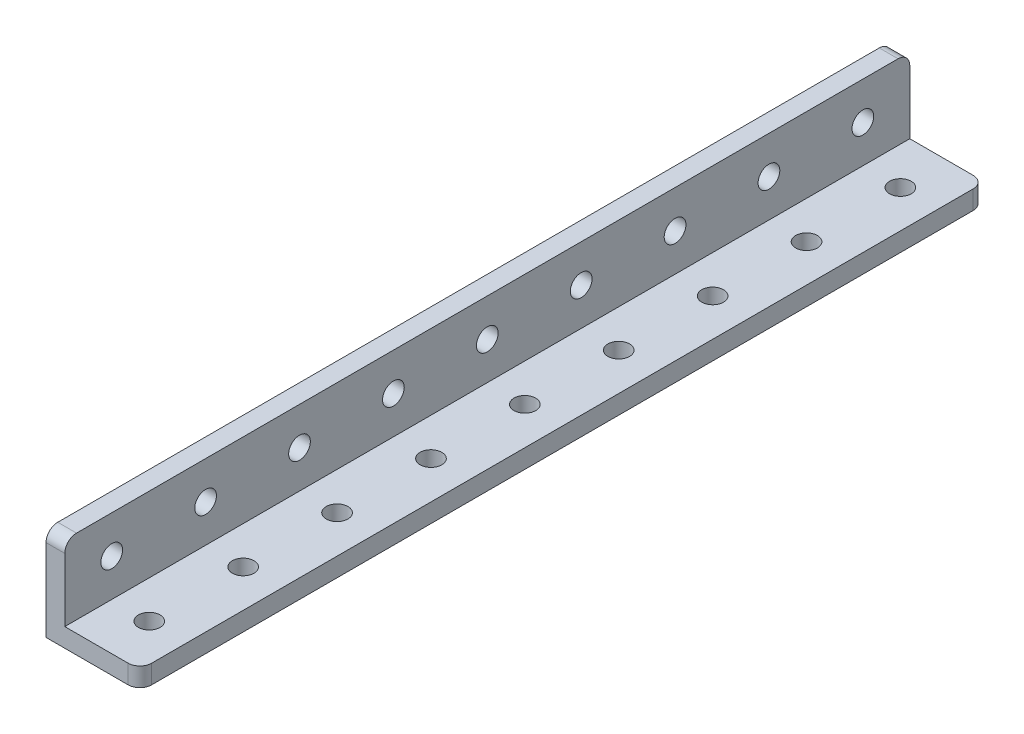
ISO-10303-21;
HEADER;
FILE_DESCRIPTION(('STEP AP214'),'2;1');
FILE_NAME('part.step','',(''),(''),'','','');
FILE_SCHEMA(('AUTOMOTIVE_DESIGN { 1 0 10303 214 1 1 1 1 }'));
ENDSEC;
DATA;
#1=APPLICATION_CONTEXT('core data for automotive mechanical design processes');
#2=APPLICATION_PROTOCOL_DEFINITION('international standard','automotive_design',2000,#1);
#3=PRODUCT_CONTEXT('',#1,'mechanical');
#4=PRODUCT('Part','Part','',(#3));
#5=PRODUCT_RELATED_PRODUCT_CATEGORY('part','',(#4));
#6=PRODUCT_DEFINITION_FORMATION('','',#4);
#7=PRODUCT_DEFINITION_CONTEXT('part definition',#1,'design');
#8=PRODUCT_DEFINITION('design','',#6,#7);
#9=PRODUCT_DEFINITION_SHAPE('','',#8);
#10=(LENGTH_UNIT() NAMED_UNIT(*) SI_UNIT(.MILLI.,.METRE.));
#11=(NAMED_UNIT(*) PLANE_ANGLE_UNIT() SI_UNIT($,.RADIAN.));
#12=(NAMED_UNIT(*) SI_UNIT($,.STERADIAN.) SOLID_ANGLE_UNIT());
#13=UNCERTAINTY_MEASURE_WITH_UNIT(LENGTH_MEASURE(1.E-05),#10,'distance_accuracy_value','');
#14=(GEOMETRIC_REPRESENTATION_CONTEXT(3) GLOBAL_UNCERTAINTY_ASSIGNED_CONTEXT((#13)) GLOBAL_UNIT_ASSIGNED_CONTEXT((#10,
#11,#12)) REPRESENTATION_CONTEXT('',''));
#15=CARTESIAN_POINT('',(0.,0.,0.));
#16=DIRECTION('',(0.,0.,1.));
#17=DIRECTION('',(1.,0.,0.));
#18=AXIS2_PLACEMENT_3D('',#15,#16,#17);
#19=CARTESIAN_POINT('',(3.2,16.,-144.));
#20=DIRECTION('',(0.,1.,0.));
#21=DIRECTION('',(0.,0.,1.));
#22=AXIS2_PLACEMENT_3D('',#19,#20,#21);
#23=PLANE('',#22);
#24=DIRECTION('',(0.,0.,1.));
#25=VECTOR('',#24,1.);
#26=CARTESIAN_POINT('',(3.2,16.,-144.));
#27=LINE('',#26,#25);
#28=CARTESIAN_POINT('',(3.2,16.,-142.));
#29=VERTEX_POINT('',#28);
#30=CARTESIAN_POINT('',(3.2,16.,-2.));
#31=VERTEX_POINT('',#30);
#32=EDGE_CURVE('E151',#29,#31,#27,.T.);
#33=ORIENTED_EDGE('',*,*,#32,.F.);
#34=DIRECTION('',(-1.,0.,0.));
#35=VECTOR('',#34,1.);
#36=CARTESIAN_POINT('',(0.,16.,-142.));
#37=LINE('',#36,#35);
#38=CARTESIAN_POINT('',(0.,16.,-142.));
#39=VERTEX_POINT('',#38);
#40=EDGE_CURVE('E165',#29,#39,#37,.T.);
#41=ORIENTED_EDGE('',*,*,#40,.T.);
#42=DIRECTION('',(0.,0.,1.));
#43=VECTOR('',#42,1.);
#44=CARTESIAN_POINT('',(0.,16.,-144.));
#45=LINE('',#44,#43);
#46=CARTESIAN_POINT('',(0.,16.,-2.));
#47=VERTEX_POINT('',#46);
#48=EDGE_CURVE('E129',#39,#47,#45,.T.);
#49=ORIENTED_EDGE('',*,*,#48,.T.);
#50=DIRECTION('',(-1.,0.,0.));
#51=VECTOR('',#50,1.);
#52=CARTESIAN_POINT('',(3.2,16.,-2.));
#53=LINE('',#52,#51);
#54=EDGE_CURVE('E154',#47,#31,#53,.F.);
#55=ORIENTED_EDGE('',*,*,#54,.T.);
#56=EDGE_LOOP('',(#33,#41,#49,#55));
#57=FACE_BOUND('',#56,.T.);
#58=ADVANCED_FACE('F32',(#57),#23,.T.);
#59=CARTESIAN_POINT('',(3.2,3.2,-144.));
#60=DIRECTION('',(1.,0.,0.));
#61=DIRECTION('',(0.,0.,-1.));
#62=AXIS2_PLACEMENT_3D('',#59,#60,#61);
#63=PLANE('',#62);
#64=CARTESIAN_POINT('',(3.2,9.6,-72.));
#65=DIRECTION('',(1.,0.,0.));
#66=DIRECTION('',(0.,0.,-1.));
#67=AXIS2_PLACEMENT_3D('',#64,#65,#66);
#68=CIRCLE('',#67,1.85);
#69=CARTESIAN_POINT('',(3.2,9.6,-73.85));
#70=VERTEX_POINT('',#69);
#71=EDGE_CURVE('E375',#70,#70,#68,.T.);
#72=ORIENTED_EDGE('',*,*,#71,.F.);
#73=EDGE_LOOP('',(#72));
#74=FACE_BOUND('',#73,.T.);
#75=CARTESIAN_POINT('',(3.2,9.6,-56.));
#76=DIRECTION('',(1.,0.,0.));
#77=DIRECTION('',(0.,0.,-1.));
#78=AXIS2_PLACEMENT_3D('',#75,#76,#77);
#79=CIRCLE('',#78,1.85);
#80=CARTESIAN_POINT('',(3.2,9.6,-57.85));
#81=VERTEX_POINT('',#80);
#82=EDGE_CURVE('E381',#81,#81,#79,.T.);
#83=ORIENTED_EDGE('',*,*,#82,.F.);
#84=EDGE_LOOP('',(#83));
#85=FACE_BOUND('',#84,.T.);
#86=CARTESIAN_POINT('',(3.2,9.6,-40.));
#87=DIRECTION('',(1.,0.,0.));
#88=DIRECTION('',(0.,0.,-1.));
#89=AXIS2_PLACEMENT_3D('',#86,#87,#88);
#90=CIRCLE('',#89,1.85);
#91=CARTESIAN_POINT('',(3.2,9.6,-41.85));
#92=VERTEX_POINT('',#91);
#93=EDGE_CURVE('E387',#92,#92,#90,.T.);
#94=ORIENTED_EDGE('',*,*,#93,.F.);
#95=EDGE_LOOP('',(#94));
#96=FACE_BOUND('',#95,.T.);
#97=CARTESIAN_POINT('',(3.2,9.6,-24.));
#98=DIRECTION('',(1.,0.,0.));
#99=DIRECTION('',(0.,0.,-1.));
#100=AXIS2_PLACEMENT_3D('',#97,#98,#99);
#101=CIRCLE('',#100,1.85);
#102=CARTESIAN_POINT('',(3.2,9.6,-25.85));
#103=VERTEX_POINT('',#102);
#104=EDGE_CURVE('E393',#103,#103,#101,.T.);
#105=ORIENTED_EDGE('',*,*,#104,.F.);
#106=EDGE_LOOP('',(#105));
#107=FACE_BOUND('',#106,.T.);
#108=CARTESIAN_POINT('',(3.2,9.6,-8.00000000000001));
#109=DIRECTION('',(1.,0.,0.));
#110=DIRECTION('',(0.,0.,-1.));
#111=AXIS2_PLACEMENT_3D('',#108,#109,#110);
#112=CIRCLE('',#111,1.85);
#113=CARTESIAN_POINT('',(3.2,9.6,-9.85000000000001));
#114=VERTEX_POINT('',#113);
#115=EDGE_CURVE('E399',#114,#114,#112,.T.);
#116=ORIENTED_EDGE('',*,*,#115,.F.);
#117=EDGE_LOOP('',(#116));
#118=FACE_BOUND('',#117,.T.);
#119=CARTESIAN_POINT('',(3.2,9.59999999999956,-136.));
#120=DIRECTION('',(1.,0.,0.));
#121=DIRECTION('',(0.,0.,-1.));
#122=AXIS2_PLACEMENT_3D('',#119,#120,#121);
#123=CIRCLE('',#122,1.85);
#124=CARTESIAN_POINT('',(3.2,9.59999999999956,-137.85));
#125=VERTEX_POINT('',#124);
#126=EDGE_CURVE('E405',#125,#125,#123,.T.);
#127=ORIENTED_EDGE('',*,*,#126,.F.);
#128=EDGE_LOOP('',(#127));
#129=FACE_BOUND('',#128,.T.);
#130=CARTESIAN_POINT('',(3.2,9.59999999999967,-120.));
#131=DIRECTION('',(1.,0.,0.));
#132=DIRECTION('',(0.,0.,-1.));
#133=AXIS2_PLACEMENT_3D('',#130,#131,#132);
#134=CIRCLE('',#133,1.85);
#135=CARTESIAN_POINT('',(3.2,9.59999999999967,-121.85));
#136=VERTEX_POINT('',#135);
#137=EDGE_CURVE('E411',#136,#136,#134,.T.);
#138=ORIENTED_EDGE('',*,*,#137,.F.);
#139=EDGE_LOOP('',(#138));
#140=FACE_BOUND('',#139,.T.);
#141=CARTESIAN_POINT('',(3.2,9.59999999999978,-104.));
#142=DIRECTION('',(1.,0.,0.));
#143=DIRECTION('',(0.,0.,-1.));
#144=AXIS2_PLACEMENT_3D('',#141,#142,#143);
#145=CIRCLE('',#144,1.84999999999999);
#146=CARTESIAN_POINT('',(3.2,9.59999999999978,-105.85));
#147=VERTEX_POINT('',#146);
#148=EDGE_CURVE('E417',#147,#147,#145,.T.);
#149=ORIENTED_EDGE('',*,*,#148,.F.);
#150=EDGE_LOOP('',(#149));
#151=FACE_BOUND('',#150,.T.);
#152=CARTESIAN_POINT('',(3.2,9.59999999999989,-87.9999999999999));
#153=DIRECTION('',(1.,0.,0.));
#154=DIRECTION('',(0.,0.,-1.));
#155=AXIS2_PLACEMENT_3D('',#152,#153,#154);
#156=CIRCLE('',#155,1.85);
#157=CARTESIAN_POINT('',(3.2,9.59999999999989,-89.8499999999999));
#158=VERTEX_POINT('',#157);
#159=EDGE_CURVE('E145',#158,#158,#156,.T.);
#160=ORIENTED_EDGE('',*,*,#159,.F.);
#161=EDGE_LOOP('',(#160));
#162=FACE_BOUND('',#161,.T.);
#163=DIRECTION('',(0.,1.,0.));
#164=VECTOR('',#163,1.);
#165=CARTESIAN_POINT('',(3.2,3.2,-144.));
#166=LINE('',#165,#164);
#167=CARTESIAN_POINT('',(3.2,3.2,-144.));
#168=VERTEX_POINT('',#167);
#169=CARTESIAN_POINT('',(3.2,14.,-144.));
#170=VERTEX_POINT('',#169);
#171=EDGE_CURVE('E137',#168,#170,#166,.T.);
#172=ORIENTED_EDGE('',*,*,#171,.T.);
#173=CARTESIAN_POINT('',(3.2,14.,-142.));
#174=DIRECTION('',(1.,0.,0.));
#175=DIRECTION('',(0.,0.,-1.));
#176=AXIS2_PLACEMENT_3D('',#173,#174,#175);
#177=CIRCLE('',#176,2.);
#178=EDGE_CURVE('E176',#170,#29,#177,.T.);
#179=ORIENTED_EDGE('',*,*,#178,.T.);
#180=ORIENTED_EDGE('',*,*,#32,.T.);
#181=CARTESIAN_POINT('',(3.2,14.,-2.));
#182=DIRECTION('',(1.,0.,0.));
#183=DIRECTION('',(0.,0.,-1.));
#184=AXIS2_PLACEMENT_3D('',#181,#182,#183);
#185=CIRCLE('',#184,2.);
#186=CARTESIAN_POINT('',(3.2,14.,0.));
#187=VERTEX_POINT('',#186);
#188=EDGE_CURVE('E174',#31,#187,#185,.T.);
#189=ORIENTED_EDGE('',*,*,#188,.T.);
#190=DIRECTION('',(0.,1.,0.));
#191=VECTOR('',#190,1.);
#192=CARTESIAN_POINT('',(3.2,3.2,0.));
#193=LINE('',#192,#191);
#194=CARTESIAN_POINT('',(3.2,3.2,0.));
#195=VERTEX_POINT('',#194);
#196=EDGE_CURVE('E122',#195,#187,#193,.T.);
#197=ORIENTED_EDGE('',*,*,#196,.F.);
#198=DIRECTION('',(0.,0.,1.));
#199=VECTOR('',#198,1.);
#200=CARTESIAN_POINT('',(3.2,3.2,-144.));
#201=LINE('',#200,#199);
#202=EDGE_CURVE('E155',#168,#195,#201,.T.);
#203=ORIENTED_EDGE('',*,*,#202,.F.);
#204=EDGE_LOOP('',(#172,#179,#180,#189,#197,#203));
#205=FACE_BOUND('',#204,.T.);
#206=ADVANCED_FACE('F200',(#74,#85,#96,#107,#118,#129,#140,#151,#162,#205),#63,.T.);
#207=CARTESIAN_POINT('',(16.,3.2,-144.));
#208=DIRECTION('',(0.,1.,0.));
#209=DIRECTION('',(-1.,0.,0.));
#210=AXIS2_PLACEMENT_3D('',#207,#208,#209);
#211=PLANE('',#210);
#212=CARTESIAN_POINT('',(9.60000000000001,3.2,-72.));
#213=DIRECTION('',(0.,1.,0.));
#214=DIRECTION('',(-1.,0.,0.));
#215=AXIS2_PLACEMENT_3D('',#212,#213,#214);
#216=CIRCLE('',#215,1.85000000000001);
#217=CARTESIAN_POINT('',(7.75,3.2,-72.));
#218=VERTEX_POINT('',#217);
#219=EDGE_CURVE('E491',#218,#218,#216,.T.);
#220=ORIENTED_EDGE('',*,*,#219,.F.);
#221=EDGE_LOOP('',(#220));
#222=FACE_BOUND('',#221,.T.);
#223=CARTESIAN_POINT('',(9.59999999999996,3.2,-56.));
#224=DIRECTION('',(0.,1.,0.));
#225=DIRECTION('',(-1.,0.,0.));
#226=AXIS2_PLACEMENT_3D('',#223,#224,#225);
#227=CIRCLE('',#226,1.84999999999999);
#228=CARTESIAN_POINT('',(7.74999999999996,3.2,-56.));
#229=VERTEX_POINT('',#228);
#230=EDGE_CURVE('E487',#229,#229,#227,.T.);
#231=ORIENTED_EDGE('',*,*,#230,.F.);
#232=EDGE_LOOP('',(#231));
#233=FACE_BOUND('',#232,.T.);
#234=CARTESIAN_POINT('',(9.5999999999999,3.2,-40.));
#235=DIRECTION('',(0.,1.,0.));
#236=DIRECTION('',(-1.,0.,0.));
#237=AXIS2_PLACEMENT_3D('',#234,#235,#236);
#238=CIRCLE('',#237,1.85);
#239=CARTESIAN_POINT('',(7.7499999999999,3.2,-40.));
#240=VERTEX_POINT('',#239);
#241=EDGE_CURVE('E483',#240,#240,#238,.T.);
#242=ORIENTED_EDGE('',*,*,#241,.F.);
#243=EDGE_LOOP('',(#242));
#244=FACE_BOUND('',#243,.T.);
#245=CARTESIAN_POINT('',(9.59999999999984,3.2,-24.));
#246=DIRECTION('',(0.,1.,0.));
#247=DIRECTION('',(-1.,0.,0.));
#248=AXIS2_PLACEMENT_3D('',#245,#246,#247);
#249=CIRCLE('',#248,1.85000000000001);
#250=CARTESIAN_POINT('',(7.74999999999984,3.2,-24.));
#251=VERTEX_POINT('',#250);
#252=EDGE_CURVE('E479',#251,#251,#249,.T.);
#253=ORIENTED_EDGE('',*,*,#252,.F.);
#254=EDGE_LOOP('',(#253));
#255=FACE_BOUND('',#254,.T.);
#256=CARTESIAN_POINT('',(9.59999999999979,3.2,-8.00000000000005));
#257=DIRECTION('',(0.,1.,0.));
#258=DIRECTION('',(-1.,0.,0.));
#259=AXIS2_PLACEMENT_3D('',#256,#257,#258);
#260=CIRCLE('',#259,1.85000000000001);
#261=CARTESIAN_POINT('',(7.74999999999978,3.2,-8.00000000000005));
#262=VERTEX_POINT('',#261);
#263=EDGE_CURVE('E475',#262,#262,#260,.T.);
#264=ORIENTED_EDGE('',*,*,#263,.F.);
#265=EDGE_LOOP('',(#264));
#266=FACE_BOUND('',#265,.T.);
#267=CARTESIAN_POINT('',(9.60000000000067,3.2,-136.));
#268=DIRECTION('',(0.,1.,0.));
#269=DIRECTION('',(-1.,0.,0.));
#270=AXIS2_PLACEMENT_3D('',#267,#268,#269);
#271=CIRCLE('',#270,1.84999999999997);
#272=CARTESIAN_POINT('',(7.7500000000007,3.2,-136.));
#273=VERTEX_POINT('',#272);
#274=EDGE_CURVE('E471',#273,#273,#271,.T.);
#275=ORIENTED_EDGE('',*,*,#274,.F.);
#276=EDGE_LOOP('',(#275));
#277=FACE_BOUND('',#276,.T.);
#278=CARTESIAN_POINT('',(9.60000000000051,3.2,-120.));
#279=DIRECTION('',(0.,1.,0.));
#280=DIRECTION('',(-1.,0.,0.));
#281=AXIS2_PLACEMENT_3D('',#278,#279,#280);
#282=CIRCLE('',#281,1.85);
#283=CARTESIAN_POINT('',(7.75000000000051,3.2,-120.));
#284=VERTEX_POINT('',#283);
#285=EDGE_CURVE('E467',#284,#284,#282,.T.);
#286=ORIENTED_EDGE('',*,*,#285,.F.);
#287=EDGE_LOOP('',(#286));
#288=FACE_BOUND('',#287,.T.);
#289=CARTESIAN_POINT('',(9.60000000000034,3.2,-104.));
#290=DIRECTION('',(0.,1.,0.));
#291=DIRECTION('',(-1.,0.,0.));
#292=AXIS2_PLACEMENT_3D('',#289,#290,#291);
#293=CIRCLE('',#292,1.84999999999998);
#294=CARTESIAN_POINT('',(7.75000000000036,3.2,-104.));
#295=VERTEX_POINT('',#294);
#296=EDGE_CURVE('E364',#295,#295,#293,.T.);
#297=ORIENTED_EDGE('',*,*,#296,.F.);
#298=EDGE_LOOP('',(#297));
#299=FACE_BOUND('',#298,.T.);
#300=CARTESIAN_POINT('',(9.60000000000018,3.2,-88.));
#301=DIRECTION('',(0.,1.,0.));
#302=DIRECTION('',(-1.,0.,0.));
#303=AXIS2_PLACEMENT_3D('',#300,#301,#302);
#304=CIRCLE('',#303,1.85);
#305=CARTESIAN_POINT('',(7.75000000000018,3.2,-88.));
#306=VERTEX_POINT('',#305);
#307=EDGE_CURVE('E363',#306,#306,#304,.T.);
#308=ORIENTED_EDGE('',*,*,#307,.F.);
#309=EDGE_LOOP('',(#308));
#310=FACE_BOUND('',#309,.T.);
#311=DIRECTION('',(0.,0.,1.));
#312=VECTOR('',#311,1.);
#313=CARTESIAN_POINT('',(16.,3.2,-144.));
#314=LINE('',#313,#312);
#315=CARTESIAN_POINT('',(16.,3.2,-142.));
#316=VERTEX_POINT('',#315);
#317=CARTESIAN_POINT('',(16.,3.2,-2.));
#318=VERTEX_POINT('',#317);
#319=EDGE_CURVE('E158',#316,#318,#314,.T.);
#320=ORIENTED_EDGE('',*,*,#319,.F.);
#321=CARTESIAN_POINT('',(14.,3.2,-142.));
#322=DIRECTION('',(0.,1.,0.));
#323=DIRECTION('',(-1.,0.,0.));
#324=AXIS2_PLACEMENT_3D('',#321,#322,#323);
#325=CIRCLE('',#324,2.);
#326=CARTESIAN_POINT('',(14.,3.2,-144.));
#327=VERTEX_POINT('',#326);
#328=EDGE_CURVE('E184',#316,#327,#325,.T.);
#329=ORIENTED_EDGE('',*,*,#328,.T.);
#330=DIRECTION('',(-1.,0.,0.));
#331=VECTOR('',#330,1.);
#332=CARTESIAN_POINT('',(16.,3.2,-144.));
#333=LINE('',#332,#331);
#334=EDGE_CURVE('E135',#327,#168,#333,.T.);
#335=ORIENTED_EDGE('',*,*,#334,.T.);
#336=ORIENTED_EDGE('',*,*,#202,.T.);
#337=DIRECTION('',(-1.,0.,0.));
#338=VECTOR('',#337,1.);
#339=CARTESIAN_POINT('',(16.,3.2,0.));
#340=LINE('',#339,#338);
#341=CARTESIAN_POINT('',(14.,3.2,0.));
#342=VERTEX_POINT('',#341);
#343=EDGE_CURVE('E147',#342,#195,#340,.T.);
#344=ORIENTED_EDGE('',*,*,#343,.F.);
#345=CARTESIAN_POINT('',(14.,3.2,-2.));
#346=DIRECTION('',(0.,1.,0.));
#347=DIRECTION('',(-1.,0.,0.));
#348=AXIS2_PLACEMENT_3D('',#345,#346,#347);
#349=CIRCLE('',#348,2.);
#350=EDGE_CURVE('E55',#342,#318,#349,.T.);
#351=ORIENTED_EDGE('',*,*,#350,.T.);
#352=EDGE_LOOP('',(#320,#329,#335,#336,#344,#351));
#353=FACE_BOUND('',#352,.T.);
#354=ADVANCED_FACE('F209',(#222,#233,#244,#255,#266,#277,#288,#299,#310,#353),#211,.T.);
#355=CARTESIAN_POINT('',(16.,0.,-144.));
#356=DIRECTION('',(1.,0.,0.));
#357=DIRECTION('',(0.,0.,-1.));
#358=AXIS2_PLACEMENT_3D('',#355,#356,#357);
#359=PLANE('',#358);
#360=DIRECTION('',(0.,0.,1.));
#361=VECTOR('',#360,1.);
#362=CARTESIAN_POINT('',(16.,0.,-144.));
#363=LINE('',#362,#361);
#364=CARTESIAN_POINT('',(16.,0.,-142.));
#365=VERTEX_POINT('',#364);
#366=CARTESIAN_POINT('',(16.,0.,-2.));
#367=VERTEX_POINT('',#366);
#368=EDGE_CURVE('E128',#365,#367,#363,.T.);
#369=ORIENTED_EDGE('',*,*,#368,.F.);
#370=DIRECTION('',(0.,1.,0.));
#371=VECTOR('',#370,1.);
#372=CARTESIAN_POINT('',(16.,3.2,-142.));
#373=LINE('',#372,#371);
#374=EDGE_CURVE('E180',#365,#316,#373,.T.);
#375=ORIENTED_EDGE('',*,*,#374,.T.);
#376=ORIENTED_EDGE('',*,*,#319,.T.);
#377=DIRECTION('',(0.,1.,0.));
#378=VECTOR('',#377,1.);
#379=CARTESIAN_POINT('',(16.,0.,-2.));
#380=LINE('',#379,#378);
#381=EDGE_CURVE('E178',#318,#367,#380,.F.);
#382=ORIENTED_EDGE('',*,*,#381,.T.);
#383=EDGE_LOOP('',(#369,#375,#376,#382));
#384=FACE_BOUND('',#383,.T.);
#385=ADVANCED_FACE('F215',(#384),#359,.T.);
#386=CARTESIAN_POINT('',(0.,0.,-144.));
#387=DIRECTION('',(0.,-1.,0.));
#388=DIRECTION('',(0.,0.,-1.));
#389=AXIS2_PLACEMENT_3D('',#386,#387,#388);
#390=PLANE('',#389);
#391=CARTESIAN_POINT('',(9.60000000000001,0.,-72.));
#392=DIRECTION('',(0.,-1.,0.));
#393=DIRECTION('',(0.,0.,-1.));
#394=AXIS2_PLACEMENT_3D('',#391,#392,#393);
#395=CIRCLE('',#394,1.85000000000001);
#396=CARTESIAN_POINT('',(9.60000000000001,0.,-73.85));
#397=VERTEX_POINT('',#396);
#398=EDGE_CURVE('E330',#397,#397,#395,.T.);
#399=ORIENTED_EDGE('',*,*,#398,.F.);
#400=EDGE_LOOP('',(#399));
#401=FACE_BOUND('',#400,.T.);
#402=CARTESIAN_POINT('',(9.59999999999996,0.,-56.));
#403=DIRECTION('',(0.,-1.,0.));
#404=DIRECTION('',(0.,0.,-1.));
#405=AXIS2_PLACEMENT_3D('',#402,#403,#404);
#406=CIRCLE('',#405,1.84999999999999);
#407=CARTESIAN_POINT('',(9.59999999999996,0.,-57.85));
#408=VERTEX_POINT('',#407);
#409=EDGE_CURVE('E334',#408,#408,#406,.T.);
#410=ORIENTED_EDGE('',*,*,#409,.F.);
#411=EDGE_LOOP('',(#410));
#412=FACE_BOUND('',#411,.T.);
#413=CARTESIAN_POINT('',(9.5999999999999,0.,-40.));
#414=DIRECTION('',(0.,-1.,0.));
#415=DIRECTION('',(0.,0.,-1.));
#416=AXIS2_PLACEMENT_3D('',#413,#414,#415);
#417=CIRCLE('',#416,1.85);
#418=CARTESIAN_POINT('',(9.5999999999999,0.,-41.85));
#419=VERTEX_POINT('',#418);
#420=EDGE_CURVE('E338',#419,#419,#417,.T.);
#421=ORIENTED_EDGE('',*,*,#420,.F.);
#422=EDGE_LOOP('',(#421));
#423=FACE_BOUND('',#422,.T.);
#424=CARTESIAN_POINT('',(9.59999999999984,0.,-24.));
#425=DIRECTION('',(0.,-1.,0.));
#426=DIRECTION('',(0.,0.,-1.));
#427=AXIS2_PLACEMENT_3D('',#424,#425,#426);
#428=CIRCLE('',#427,1.85000000000001);
#429=CARTESIAN_POINT('',(9.59999999999984,0.,-25.85));
#430=VERTEX_POINT('',#429);
#431=EDGE_CURVE('E342',#430,#430,#428,.T.);
#432=ORIENTED_EDGE('',*,*,#431,.F.);
#433=EDGE_LOOP('',(#432));
#434=FACE_BOUND('',#433,.T.);
#435=CARTESIAN_POINT('',(9.59999999999979,0.,-8.00000000000005));
#436=DIRECTION('',(0.,-1.,0.));
#437=DIRECTION('',(0.,0.,-1.));
#438=AXIS2_PLACEMENT_3D('',#435,#436,#437);
#439=CIRCLE('',#438,1.85000000000001);
#440=CARTESIAN_POINT('',(9.59999999999979,0.,-9.85000000000005));
#441=VERTEX_POINT('',#440);
#442=EDGE_CURVE('E346',#441,#441,#439,.T.);
#443=ORIENTED_EDGE('',*,*,#442,.F.);
#444=EDGE_LOOP('',(#443));
#445=FACE_BOUND('',#444,.T.);
#446=CARTESIAN_POINT('',(9.60000000000067,0.,-136.));
#447=DIRECTION('',(0.,-1.,0.));
#448=DIRECTION('',(0.,0.,1.));
#449=AXIS2_PLACEMENT_3D('',#446,#447,#448);
#450=CIRCLE('',#449,1.84999999999997);
#451=CARTESIAN_POINT('',(9.60000000000067,0.,-134.15));
#452=VERTEX_POINT('',#451);
#453=EDGE_CURVE('E350',#452,#452,#450,.T.);
#454=ORIENTED_EDGE('',*,*,#453,.F.);
#455=EDGE_LOOP('',(#454));
#456=FACE_BOUND('',#455,.T.);
#457=CARTESIAN_POINT('',(9.60000000000051,0.,-120.));
#458=DIRECTION('',(0.,-1.,0.));
#459=DIRECTION('',(0.,0.,1.));
#460=AXIS2_PLACEMENT_3D('',#457,#458,#459);
#461=CIRCLE('',#460,1.85);
#462=CARTESIAN_POINT('',(9.60000000000051,0.,-118.15));
#463=VERTEX_POINT('',#462);
#464=EDGE_CURVE('E354',#463,#463,#461,.T.);
#465=ORIENTED_EDGE('',*,*,#464,.F.);
#466=EDGE_LOOP('',(#465));
#467=FACE_BOUND('',#466,.T.);
#468=CARTESIAN_POINT('',(9.60000000000034,0.,-104.));
#469=DIRECTION('',(0.,-1.,0.));
#470=DIRECTION('',(0.,0.,1.));
#471=AXIS2_PLACEMENT_3D('',#468,#469,#470);
#472=CIRCLE('',#471,1.84999999999998);
#473=CARTESIAN_POINT('',(9.60000000000034,0.,-102.15));
#474=VERTEX_POINT('',#473);
#475=EDGE_CURVE('E358',#474,#474,#472,.T.);
#476=ORIENTED_EDGE('',*,*,#475,.F.);
#477=EDGE_LOOP('',(#476));
#478=FACE_BOUND('',#477,.T.);
#479=CARTESIAN_POINT('',(9.60000000000018,0.,-88.));
#480=DIRECTION('',(0.,-1.,0.));
#481=DIRECTION('',(0.,0.,1.));
#482=AXIS2_PLACEMENT_3D('',#479,#480,#481);
#483=CIRCLE('',#482,1.85);
#484=CARTESIAN_POINT('',(9.60000000000018,0.,-86.1499999999999));
#485=VERTEX_POINT('',#484);
#486=EDGE_CURVE('E361',#485,#485,#483,.T.);
#487=ORIENTED_EDGE('',*,*,#486,.F.);
#488=EDGE_LOOP('',(#487));
#489=FACE_BOUND('',#488,.T.);
#490=DIRECTION('',(1.,0.,0.));
#491=VECTOR('',#490,1.);
#492=CARTESIAN_POINT('',(0.,0.,-144.));
#493=LINE('',#492,#491);
#494=CARTESIAN_POINT('',(0.,0.,-144.));
#495=VERTEX_POINT('',#494);
#496=CARTESIAN_POINT('',(14.,0.,-144.));
#497=VERTEX_POINT('',#496);
#498=EDGE_CURVE('E121',#495,#497,#493,.T.);
#499=ORIENTED_EDGE('',*,*,#498,.T.);
#500=CARTESIAN_POINT('',(14.,0.,-142.));
#501=DIRECTION('',(0.,-1.,0.));
#502=DIRECTION('',(0.,0.,-1.));
#503=AXIS2_PLACEMENT_3D('',#500,#501,#502);
#504=CIRCLE('',#503,2.);
#505=EDGE_CURVE('E187',#497,#365,#504,.T.);
#506=ORIENTED_EDGE('',*,*,#505,.T.);
#507=ORIENTED_EDGE('',*,*,#368,.T.);
#508=CARTESIAN_POINT('',(14.,0.,-2.));
#509=DIRECTION('',(0.,-1.,0.));
#510=DIRECTION('',(0.,0.,-1.));
#511=AXIS2_PLACEMENT_3D('',#508,#509,#510);
#512=CIRCLE('',#511,2.);
#513=CARTESIAN_POINT('',(14.,0.,0.));
#514=VERTEX_POINT('',#513);
#515=EDGE_CURVE('E47',#367,#514,#512,.T.);
#516=ORIENTED_EDGE('',*,*,#515,.T.);
#517=DIRECTION('',(1.,0.,0.));
#518=VECTOR('',#517,1.);
#519=CARTESIAN_POINT('',(0.,0.,0.));
#520=LINE('',#519,#518);
#521=CARTESIAN_POINT('',(0.,0.,0.));
#522=VERTEX_POINT('',#521);
#523=EDGE_CURVE('E127',#522,#514,#520,.T.);
#524=ORIENTED_EDGE('',*,*,#523,.F.);
#525=DIRECTION('',(0.,0.,1.));
#526=VECTOR('',#525,1.);
#527=CARTESIAN_POINT('',(0.,0.,-144.));
#528=LINE('',#527,#526);
#529=EDGE_CURVE('E116',#495,#522,#528,.T.);
#530=ORIENTED_EDGE('',*,*,#529,.F.);
#531=EDGE_LOOP('',(#499,#506,#507,#516,#524,#530));
#532=FACE_BOUND('',#531,.T.);
#533=ADVANCED_FACE('F125',(#401,#412,#423,#434,#445,#456,#467,#478,#489,#532),#390,.T.);
#534=CARTESIAN_POINT('',(0.,16.,-144.));
#535=DIRECTION('',(-1.,0.,0.));
#536=DIRECTION('',(0.,-1.,0.));
#537=AXIS2_PLACEMENT_3D('',#534,#535,#536);
#538=PLANE('',#537);
#539=CARTESIAN_POINT('',(0.,9.6,-72.));
#540=DIRECTION('',(-1.,0.,0.));
#541=DIRECTION('',(0.,-1.,0.));
#542=AXIS2_PLACEMENT_3D('',#539,#540,#541);
#543=CIRCLE('',#542,1.85);
#544=CARTESIAN_POINT('',(0.,7.74999999999999,-72.));
#545=VERTEX_POINT('',#544);
#546=EDGE_CURVE('E367',#545,#545,#543,.T.);
#547=ORIENTED_EDGE('',*,*,#546,.F.);
#548=EDGE_LOOP('',(#547));
#549=FACE_BOUND('',#548,.T.);
#550=CARTESIAN_POINT('',(0.,9.6,-56.));
#551=DIRECTION('',(-1.,0.,0.));
#552=DIRECTION('',(0.,-1.,0.));
#553=AXIS2_PLACEMENT_3D('',#550,#551,#552);
#554=CIRCLE('',#553,1.85);
#555=CARTESIAN_POINT('',(0.,7.75,-56.));
#556=VERTEX_POINT('',#555);
#557=EDGE_CURVE('E378',#556,#556,#554,.T.);
#558=ORIENTED_EDGE('',*,*,#557,.F.);
#559=EDGE_LOOP('',(#558));
#560=FACE_BOUND('',#559,.T.);
#561=CARTESIAN_POINT('',(0.,9.6,-40.));
#562=DIRECTION('',(-1.,0.,0.));
#563=DIRECTION('',(0.,-1.,0.));
#564=AXIS2_PLACEMENT_3D('',#561,#562,#563);
#565=CIRCLE('',#564,1.85);
#566=CARTESIAN_POINT('',(0.,7.75,-40.));
#567=VERTEX_POINT('',#566);
#568=EDGE_CURVE('E384',#567,#567,#565,.T.);
#569=ORIENTED_EDGE('',*,*,#568,.F.);
#570=EDGE_LOOP('',(#569));
#571=FACE_BOUND('',#570,.T.);
#572=CARTESIAN_POINT('',(0.,9.6,-24.));
#573=DIRECTION('',(-1.,0.,0.));
#574=DIRECTION('',(0.,-1.,0.));
#575=AXIS2_PLACEMENT_3D('',#572,#573,#574);
#576=CIRCLE('',#575,1.85);
#577=CARTESIAN_POINT('',(0.,7.74999999999999,-24.));
#578=VERTEX_POINT('',#577);
#579=EDGE_CURVE('E390',#578,#578,#576,.T.);
#580=ORIENTED_EDGE('',*,*,#579,.F.);
#581=EDGE_LOOP('',(#580));
#582=FACE_BOUND('',#581,.T.);
#583=CARTESIAN_POINT('',(0.,9.6,-8.00000000000001));
#584=DIRECTION('',(-1.,0.,0.));
#585=DIRECTION('',(0.,-1.,0.));
#586=AXIS2_PLACEMENT_3D('',#583,#584,#585);
#587=CIRCLE('',#586,1.85);
#588=CARTESIAN_POINT('',(0.,7.74999999999999,-8.00000000000001));
#589=VERTEX_POINT('',#588);
#590=EDGE_CURVE('E396',#589,#589,#587,.T.);
#591=ORIENTED_EDGE('',*,*,#590,.F.);
#592=EDGE_LOOP('',(#591));
#593=FACE_BOUND('',#592,.T.);
#594=CARTESIAN_POINT('',(0.,9.59999999999956,-136.));
#595=DIRECTION('',(-1.,0.,0.));
#596=DIRECTION('',(0.,1.,0.));
#597=AXIS2_PLACEMENT_3D('',#594,#595,#596);
#598=CIRCLE('',#597,1.85);
#599=CARTESIAN_POINT('',(0.,11.4499999999996,-136.));
#600=VERTEX_POINT('',#599);
#601=EDGE_CURVE('E402',#600,#600,#598,.T.);
#602=ORIENTED_EDGE('',*,*,#601,.F.);
#603=EDGE_LOOP('',(#602));
#604=FACE_BOUND('',#603,.T.);
#605=CARTESIAN_POINT('',(0.,9.59999999999967,-120.));
#606=DIRECTION('',(-1.,0.,0.));
#607=DIRECTION('',(0.,1.,0.));
#608=AXIS2_PLACEMENT_3D('',#605,#606,#607);
#609=CIRCLE('',#608,1.85);
#610=CARTESIAN_POINT('',(0.,11.4499999999997,-120.));
#611=VERTEX_POINT('',#610);
#612=EDGE_CURVE('E408',#611,#611,#609,.T.);
#613=ORIENTED_EDGE('',*,*,#612,.F.);
#614=EDGE_LOOP('',(#613));
#615=FACE_BOUND('',#614,.T.);
#616=CARTESIAN_POINT('',(0.,9.59999999999978,-104.));
#617=DIRECTION('',(-1.,0.,0.));
#618=DIRECTION('',(0.,1.,0.));
#619=AXIS2_PLACEMENT_3D('',#616,#617,#618);
#620=CIRCLE('',#619,1.84999999999999);
#621=CARTESIAN_POINT('',(0.,11.4499999999998,-104.));
#622=VERTEX_POINT('',#621);
#623=EDGE_CURVE('E414',#622,#622,#620,.T.);
#624=ORIENTED_EDGE('',*,*,#623,.F.);
#625=EDGE_LOOP('',(#624));
#626=FACE_BOUND('',#625,.T.);
#627=CARTESIAN_POINT('',(0.,9.59999999999989,-87.9999999999999));
#628=DIRECTION('',(-1.,0.,0.));
#629=DIRECTION('',(0.,1.,0.));
#630=AXIS2_PLACEMENT_3D('',#627,#628,#629);
#631=CIRCLE('',#630,1.85);
#632=CARTESIAN_POINT('',(0.,11.4499999999999,-87.9999999999999));
#633=VERTEX_POINT('',#632);
#634=EDGE_CURVE('E420',#633,#633,#631,.T.);
#635=ORIENTED_EDGE('',*,*,#634,.F.);
#636=EDGE_LOOP('',(#635));
#637=FACE_BOUND('',#636,.T.);
#638=ORIENTED_EDGE('',*,*,#48,.F.);
#639=CARTESIAN_POINT('',(0.,14.,-142.));
#640=DIRECTION('',(-1.,0.,0.));
#641=DIRECTION('',(0.,-1.,0.));
#642=AXIS2_PLACEMENT_3D('',#639,#640,#641);
#643=CIRCLE('',#642,2.);
#644=CARTESIAN_POINT('',(0.,14.,-144.));
#645=VERTEX_POINT('',#644);
#646=EDGE_CURVE('E117',#39,#645,#643,.T.);
#647=ORIENTED_EDGE('',*,*,#646,.T.);
#648=DIRECTION('',(0.,-1.,0.));
#649=VECTOR('',#648,1.);
#650=CARTESIAN_POINT('',(0.,16.,-144.));
#651=LINE('',#650,#649);
#652=EDGE_CURVE('E111',#645,#495,#651,.T.);
#653=ORIENTED_EDGE('',*,*,#652,.T.);
#654=ORIENTED_EDGE('',*,*,#529,.T.);
#655=DIRECTION('',(0.,-1.,0.));
#656=VECTOR('',#655,1.);
#657=CARTESIAN_POINT('',(0.,16.,0.));
#658=LINE('',#657,#656);
#659=CARTESIAN_POINT('',(0.,14.,0.));
#660=VERTEX_POINT('',#659);
#661=EDGE_CURVE('E143',#660,#522,#658,.T.);
#662=ORIENTED_EDGE('',*,*,#661,.F.);
#663=CARTESIAN_POINT('',(0.,14.,-2.));
#664=DIRECTION('',(-1.,0.,0.));
#665=DIRECTION('',(0.,-1.,0.));
#666=AXIS2_PLACEMENT_3D('',#663,#664,#665);
#667=CIRCLE('',#666,2.);
#668=EDGE_CURVE('E168',#660,#47,#667,.T.);
#669=ORIENTED_EDGE('',*,*,#668,.T.);
#670=EDGE_LOOP('',(#638,#647,#653,#654,#662,#669));
#671=FACE_BOUND('',#670,.T.);
#672=ADVANCED_FACE('F114',(#549,#560,#571,#582,#593,#604,#615,#626,#637,#671),#538,.T.);
#673=CARTESIAN_POINT('',(0.,0.,-144.));
#674=DIRECTION('',(0.,0.,1.));
#675=DIRECTION('',(1.,0.,0.));
#676=AXIS2_PLACEMENT_3D('',#673,#674,#675);
#677=PLANE('',#676);
#678=ORIENTED_EDGE('',*,*,#652,.F.);
#679=DIRECTION('',(-1.,0.,0.));
#680=VECTOR('',#679,1.);
#681=CARTESIAN_POINT('',(3.2,14.,-144.));
#682=LINE('',#681,#680);
#683=EDGE_CURVE('E172',#645,#170,#682,.F.);
#684=ORIENTED_EDGE('',*,*,#683,.T.);
#685=ORIENTED_EDGE('',*,*,#171,.F.);
#686=ORIENTED_EDGE('',*,*,#334,.F.);
#687=DIRECTION('',(0.,1.,0.));
#688=VECTOR('',#687,1.);
#689=CARTESIAN_POINT('',(14.,0.,-144.));
#690=LINE('',#689,#688);
#691=EDGE_CURVE('E134',#327,#497,#690,.F.);
#692=ORIENTED_EDGE('',*,*,#691,.T.);
#693=ORIENTED_EDGE('',*,*,#498,.F.);
#694=EDGE_LOOP('',(#678,#684,#685,#686,#692,#693));
#695=FACE_BOUND('',#694,.T.);
#696=ADVANCED_FACE('F131',(#695),#677,.F.);
#697=CARTESIAN_POINT('',(0.,0.,0.));
#698=DIRECTION('',(0.,0.,1.));
#699=DIRECTION('',(1.,0.,0.));
#700=AXIS2_PLACEMENT_3D('',#697,#698,#699);
#701=PLANE('',#700);
#702=ORIENTED_EDGE('',*,*,#523,.T.);
#703=DIRECTION('',(0.,1.,0.));
#704=VECTOR('',#703,1.);
#705=CARTESIAN_POINT('',(14.,0.,0.));
#706=LINE('',#705,#704);
#707=EDGE_CURVE('E11',#514,#342,#706,.T.);
#708=ORIENTED_EDGE('',*,*,#707,.T.);
#709=ORIENTED_EDGE('',*,*,#343,.T.);
#710=ORIENTED_EDGE('',*,*,#196,.T.);
#711=DIRECTION('',(-1.,0.,0.));
#712=VECTOR('',#711,1.);
#713=CARTESIAN_POINT('',(0.,14.,0.));
#714=LINE('',#713,#712);
#715=EDGE_CURVE('E40',#187,#660,#714,.T.);
#716=ORIENTED_EDGE('',*,*,#715,.T.);
#717=ORIENTED_EDGE('',*,*,#661,.T.);
#718=EDGE_LOOP('',(#702,#708,#709,#710,#716,#717));
#719=FACE_BOUND('',#718,.T.);
#720=ADVANCED_FACE('F191',(#719),#701,.T.);
#721=CARTESIAN_POINT('',(16.,9.59999999999989,-87.9999999999999));
#722=DIRECTION('',(-1.,0.,0.));
#723=DIRECTION('',(0.,-1.,0.));
#724=AXIS2_PLACEMENT_3D('',#721,#722,#723);
#725=CYLINDRICAL_SURFACE('',#724,1.85);
#726=ORIENTED_EDGE('',*,*,#159,.T.);
#727=EDGE_LOOP('',(#726));
#728=FACE_BOUND('',#727,.T.);
#729=ORIENTED_EDGE('',*,*,#634,.T.);
#730=EDGE_LOOP('',(#729));
#731=FACE_BOUND('',#730,.T.);
#732=ADVANCED_FACE('F308',(#728,#731),#725,.F.);
#733=CARTESIAN_POINT('',(16.,9.59999999999978,-104.));
#734=DIRECTION('',(-1.,0.,0.));
#735=DIRECTION('',(0.,-1.,0.));
#736=AXIS2_PLACEMENT_3D('',#733,#734,#735);
#737=CYLINDRICAL_SURFACE('',#736,1.84999999999999);
#738=ORIENTED_EDGE('',*,*,#148,.T.);
#739=EDGE_LOOP('',(#738));
#740=FACE_BOUND('',#739,.T.);
#741=ORIENTED_EDGE('',*,*,#623,.T.);
#742=EDGE_LOOP('',(#741));
#743=FACE_BOUND('',#742,.T.);
#744=ADVANCED_FACE('F304',(#740,#743),#737,.F.);
#745=CARTESIAN_POINT('',(16.,9.59999999999967,-120.));
#746=DIRECTION('',(-1.,0.,0.));
#747=DIRECTION('',(0.,-1.,0.));
#748=AXIS2_PLACEMENT_3D('',#745,#746,#747);
#749=CYLINDRICAL_SURFACE('',#748,1.85);
#750=ORIENTED_EDGE('',*,*,#137,.T.);
#751=EDGE_LOOP('',(#750));
#752=FACE_BOUND('',#751,.T.);
#753=ORIENTED_EDGE('',*,*,#612,.T.);
#754=EDGE_LOOP('',(#753));
#755=FACE_BOUND('',#754,.T.);
#756=ADVANCED_FACE('F300',(#752,#755),#749,.F.);
#757=CARTESIAN_POINT('',(16.,9.59999999999956,-136.));
#758=DIRECTION('',(-1.,0.,0.));
#759=DIRECTION('',(0.,-1.,0.));
#760=AXIS2_PLACEMENT_3D('',#757,#758,#759);
#761=CYLINDRICAL_SURFACE('',#760,1.85);
#762=ORIENTED_EDGE('',*,*,#126,.T.);
#763=EDGE_LOOP('',(#762));
#764=FACE_BOUND('',#763,.T.);
#765=ORIENTED_EDGE('',*,*,#601,.T.);
#766=EDGE_LOOP('',(#765));
#767=FACE_BOUND('',#766,.T.);
#768=ADVANCED_FACE('F296',(#764,#767),#761,.F.);
#769=CARTESIAN_POINT('',(16.,9.6,-8.00000000000001));
#770=DIRECTION('',(-1.,0.,0.));
#771=DIRECTION('',(0.,-1.,0.));
#772=AXIS2_PLACEMENT_3D('',#769,#770,#771);
#773=CYLINDRICAL_SURFACE('',#772,1.85);
#774=ORIENTED_EDGE('',*,*,#115,.T.);
#775=EDGE_LOOP('',(#774));
#776=FACE_BOUND('',#775,.T.);
#777=ORIENTED_EDGE('',*,*,#590,.T.);
#778=EDGE_LOOP('',(#777));
#779=FACE_BOUND('',#778,.T.);
#780=ADVANCED_FACE('F292',(#776,#779),#773,.F.);
#781=CARTESIAN_POINT('',(16.,9.6,-24.));
#782=DIRECTION('',(-1.,0.,0.));
#783=DIRECTION('',(0.,-1.,0.));
#784=AXIS2_PLACEMENT_3D('',#781,#782,#783);
#785=CYLINDRICAL_SURFACE('',#784,1.85);
#786=ORIENTED_EDGE('',*,*,#104,.T.);
#787=EDGE_LOOP('',(#786));
#788=FACE_BOUND('',#787,.T.);
#789=ORIENTED_EDGE('',*,*,#579,.T.);
#790=EDGE_LOOP('',(#789));
#791=FACE_BOUND('',#790,.T.);
#792=ADVANCED_FACE('F288',(#788,#791),#785,.F.);
#793=CARTESIAN_POINT('',(16.,9.6,-40.));
#794=DIRECTION('',(-1.,0.,0.));
#795=DIRECTION('',(0.,-1.,0.));
#796=AXIS2_PLACEMENT_3D('',#793,#794,#795);
#797=CYLINDRICAL_SURFACE('',#796,1.85);
#798=ORIENTED_EDGE('',*,*,#93,.T.);
#799=EDGE_LOOP('',(#798));
#800=FACE_BOUND('',#799,.T.);
#801=ORIENTED_EDGE('',*,*,#568,.T.);
#802=EDGE_LOOP('',(#801));
#803=FACE_BOUND('',#802,.T.);
#804=ADVANCED_FACE('F284',(#800,#803),#797,.F.);
#805=CARTESIAN_POINT('',(16.,9.6,-56.));
#806=DIRECTION('',(-1.,0.,0.));
#807=DIRECTION('',(0.,-1.,0.));
#808=AXIS2_PLACEMENT_3D('',#805,#806,#807);
#809=CYLINDRICAL_SURFACE('',#808,1.85);
#810=ORIENTED_EDGE('',*,*,#82,.T.);
#811=EDGE_LOOP('',(#810));
#812=FACE_BOUND('',#811,.T.);
#813=ORIENTED_EDGE('',*,*,#557,.T.);
#814=EDGE_LOOP('',(#813));
#815=FACE_BOUND('',#814,.T.);
#816=ADVANCED_FACE('F280',(#812,#815),#809,.F.);
#817=CARTESIAN_POINT('',(16.,9.6,-72.));
#818=DIRECTION('',(-1.,0.,0.));
#819=DIRECTION('',(0.,-1.,0.));
#820=AXIS2_PLACEMENT_3D('',#817,#818,#819);
#821=CYLINDRICAL_SURFACE('',#820,1.85);
#822=ORIENTED_EDGE('',*,*,#71,.T.);
#823=EDGE_LOOP('',(#822));
#824=FACE_BOUND('',#823,.T.);
#825=ORIENTED_EDGE('',*,*,#546,.T.);
#826=EDGE_LOOP('',(#825));
#827=FACE_BOUND('',#826,.T.);
#828=ADVANCED_FACE('F276',(#824,#827),#821,.F.);
#829=CARTESIAN_POINT('',(9.60000000000018,16.,-88.));
#830=DIRECTION('',(0.,-1.,0.));
#831=DIRECTION('',(0.,0.,-1.));
#832=AXIS2_PLACEMENT_3D('',#829,#830,#831);
#833=CYLINDRICAL_SURFACE('',#832,1.85);
#834=ORIENTED_EDGE('',*,*,#307,.T.);
#835=EDGE_LOOP('',(#834));
#836=FACE_BOUND('',#835,.T.);
#837=ORIENTED_EDGE('',*,*,#486,.T.);
#838=EDGE_LOOP('',(#837));
#839=FACE_BOUND('',#838,.T.);
#840=ADVANCED_FACE('F272',(#836,#839),#833,.F.);
#841=CARTESIAN_POINT('',(9.60000000000034,16.,-104.));
#842=DIRECTION('',(0.,-1.,0.));
#843=DIRECTION('',(0.,0.,-1.));
#844=AXIS2_PLACEMENT_3D('',#841,#842,#843);
#845=CYLINDRICAL_SURFACE('',#844,1.84999999999998);
#846=ORIENTED_EDGE('',*,*,#296,.T.);
#847=EDGE_LOOP('',(#846));
#848=FACE_BOUND('',#847,.T.);
#849=ORIENTED_EDGE('',*,*,#475,.T.);
#850=EDGE_LOOP('',(#849));
#851=FACE_BOUND('',#850,.T.);
#852=ADVANCED_FACE('F268',(#848,#851),#845,.F.);
#853=CARTESIAN_POINT('',(9.60000000000051,16.,-120.));
#854=DIRECTION('',(0.,-1.,0.));
#855=DIRECTION('',(0.,0.,-1.));
#856=AXIS2_PLACEMENT_3D('',#853,#854,#855);
#857=CYLINDRICAL_SURFACE('',#856,1.85);
#858=ORIENTED_EDGE('',*,*,#285,.T.);
#859=EDGE_LOOP('',(#858));
#860=FACE_BOUND('',#859,.T.);
#861=ORIENTED_EDGE('',*,*,#464,.T.);
#862=EDGE_LOOP('',(#861));
#863=FACE_BOUND('',#862,.T.);
#864=ADVANCED_FACE('F264',(#860,#863),#857,.F.);
#865=CARTESIAN_POINT('',(9.60000000000067,16.,-136.));
#866=DIRECTION('',(0.,-1.,0.));
#867=DIRECTION('',(0.,0.,-1.));
#868=AXIS2_PLACEMENT_3D('',#865,#866,#867);
#869=CYLINDRICAL_SURFACE('',#868,1.84999999999997);
#870=ORIENTED_EDGE('',*,*,#274,.T.);
#871=EDGE_LOOP('',(#870));
#872=FACE_BOUND('',#871,.T.);
#873=ORIENTED_EDGE('',*,*,#453,.T.);
#874=EDGE_LOOP('',(#873));
#875=FACE_BOUND('',#874,.T.);
#876=ADVANCED_FACE('F260',(#872,#875),#869,.F.);
#877=CARTESIAN_POINT('',(9.59999999999979,16.,-8.00000000000005));
#878=DIRECTION('',(0.,-1.,0.));
#879=DIRECTION('',(0.,0.,-1.));
#880=AXIS2_PLACEMENT_3D('',#877,#878,#879);
#881=CYLINDRICAL_SURFACE('',#880,1.85000000000001);
#882=ORIENTED_EDGE('',*,*,#263,.T.);
#883=EDGE_LOOP('',(#882));
#884=FACE_BOUND('',#883,.T.);
#885=ORIENTED_EDGE('',*,*,#442,.T.);
#886=EDGE_LOOP('',(#885));
#887=FACE_BOUND('',#886,.T.);
#888=ADVANCED_FACE('F256',(#884,#887),#881,.F.);
#889=CARTESIAN_POINT('',(9.59999999999984,16.,-24.));
#890=DIRECTION('',(0.,-1.,0.));
#891=DIRECTION('',(0.,0.,-1.));
#892=AXIS2_PLACEMENT_3D('',#889,#890,#891);
#893=CYLINDRICAL_SURFACE('',#892,1.85000000000001);
#894=ORIENTED_EDGE('',*,*,#252,.T.);
#895=EDGE_LOOP('',(#894));
#896=FACE_BOUND('',#895,.T.);
#897=ORIENTED_EDGE('',*,*,#431,.T.);
#898=EDGE_LOOP('',(#897));
#899=FACE_BOUND('',#898,.T.);
#900=ADVANCED_FACE('F252',(#896,#899),#893,.F.);
#901=CARTESIAN_POINT('',(9.5999999999999,16.,-40.));
#902=DIRECTION('',(0.,-1.,0.));
#903=DIRECTION('',(0.,0.,-1.));
#904=AXIS2_PLACEMENT_3D('',#901,#902,#903);
#905=CYLINDRICAL_SURFACE('',#904,1.85);
#906=ORIENTED_EDGE('',*,*,#241,.T.);
#907=EDGE_LOOP('',(#906));
#908=FACE_BOUND('',#907,.T.);
#909=ORIENTED_EDGE('',*,*,#420,.T.);
#910=EDGE_LOOP('',(#909));
#911=FACE_BOUND('',#910,.T.);
#912=ADVANCED_FACE('F244',(#908,#911),#905,.F.);
#913=CARTESIAN_POINT('',(9.59999999999996,16.,-56.));
#914=DIRECTION('',(0.,-1.,0.));
#915=DIRECTION('',(0.,0.,-1.));
#916=AXIS2_PLACEMENT_3D('',#913,#914,#915);
#917=CYLINDRICAL_SURFACE('',#916,1.84999999999999);
#918=ORIENTED_EDGE('',*,*,#230,.T.);
#919=EDGE_LOOP('',(#918));
#920=FACE_BOUND('',#919,.T.);
#921=ORIENTED_EDGE('',*,*,#409,.T.);
#922=EDGE_LOOP('',(#921));
#923=FACE_BOUND('',#922,.T.);
#924=ADVANCED_FACE('F238',(#920,#923),#917,.F.);
#925=CARTESIAN_POINT('',(9.60000000000001,16.,-72.));
#926=DIRECTION('',(0.,-1.,0.));
#927=DIRECTION('',(0.,0.,-1.));
#928=AXIS2_PLACEMENT_3D('',#925,#926,#927);
#929=CYLINDRICAL_SURFACE('',#928,1.85000000000001);
#930=ORIENTED_EDGE('',*,*,#219,.T.);
#931=EDGE_LOOP('',(#930));
#932=FACE_BOUND('',#931,.T.);
#933=ORIENTED_EDGE('',*,*,#398,.T.);
#934=EDGE_LOOP('',(#933));
#935=FACE_BOUND('',#934,.T.);
#936=ADVANCED_FACE('F234',(#932,#935),#929,.F.);
#937=CARTESIAN_POINT('',(3.2,14.,-142.));
#938=DIRECTION('',(1.,0.,0.));
#939=DIRECTION('',(0.,0.,-1.));
#940=AXIS2_PLACEMENT_3D('',#937,#938,#939);
#941=CYLINDRICAL_SURFACE('',#940,2.);
#942=ORIENTED_EDGE('',*,*,#178,.F.);
#943=ORIENTED_EDGE('',*,*,#683,.F.);
#944=ORIENTED_EDGE('',*,*,#646,.F.);
#945=ORIENTED_EDGE('',*,*,#40,.F.);
#946=EDGE_LOOP('',(#942,#943,#944,#945));
#947=FACE_BOUND('',#946,.T.);
#948=ADVANCED_FACE('F204',(#947),#941,.T.);
#949=CARTESIAN_POINT('',(14.,0.,-142.));
#950=DIRECTION('',(0.,-1.,0.));
#951=DIRECTION('',(0.,0.,-1.));
#952=AXIS2_PLACEMENT_3D('',#949,#950,#951);
#953=CYLINDRICAL_SURFACE('',#952,2.);
#954=ORIENTED_EDGE('',*,*,#505,.F.);
#955=ORIENTED_EDGE('',*,*,#691,.F.);
#956=ORIENTED_EDGE('',*,*,#328,.F.);
#957=ORIENTED_EDGE('',*,*,#374,.F.);
#958=EDGE_LOOP('',(#954,#955,#956,#957));
#959=FACE_BOUND('',#958,.T.);
#960=ADVANCED_FACE('F211',(#959),#953,.T.);
#961=CARTESIAN_POINT('',(14.,0.,-2.));
#962=DIRECTION('',(0.,1.,0.));
#963=DIRECTION('',(0.,0.,1.));
#964=AXIS2_PLACEMENT_3D('',#961,#962,#963);
#965=CYLINDRICAL_SURFACE('',#964,2.);
#966=ORIENTED_EDGE('',*,*,#515,.F.);
#967=ORIENTED_EDGE('',*,*,#381,.F.);
#968=ORIENTED_EDGE('',*,*,#350,.F.);
#969=ORIENTED_EDGE('',*,*,#707,.F.);
#970=EDGE_LOOP('',(#966,#967,#968,#969));
#971=FACE_BOUND('',#970,.T.);
#972=ADVANCED_FACE('F216',(#971),#965,.T.);
#973=CARTESIAN_POINT('',(0.,14.,-2.));
#974=DIRECTION('',(-1.,0.,0.));
#975=DIRECTION('',(0.,0.,1.));
#976=AXIS2_PLACEMENT_3D('',#973,#974,#975);
#977=CYLINDRICAL_SURFACE('',#976,2.);
#978=ORIENTED_EDGE('',*,*,#188,.F.);
#979=ORIENTED_EDGE('',*,*,#54,.F.);
#980=ORIENTED_EDGE('',*,*,#668,.F.);
#981=ORIENTED_EDGE('',*,*,#715,.F.);
#982=EDGE_LOOP('',(#978,#979,#980,#981));
#983=FACE_BOUND('',#982,.T.);
#984=ADVANCED_FACE('F34',(#983),#977,.T.);
#985=CLOSED_SHELL('',(#58,#206,#354,#385,#533,#672,#696,#720,#732,#744,#756,#768,#780,#792,#804,
#816,#828,#840,#852,#864,#876,#888,#900,#912,#924,#936,#948,#960,#972,#984));
#986=MANIFOLD_SOLID_BREP('B2',#985);
#987=ADVANCED_BREP_SHAPE_REPRESENTATION('',(#18,#986),#14);
#988=SHAPE_DEFINITION_REPRESENTATION(#9,#987);
ENDSEC;
END-ISO-10303-21;
